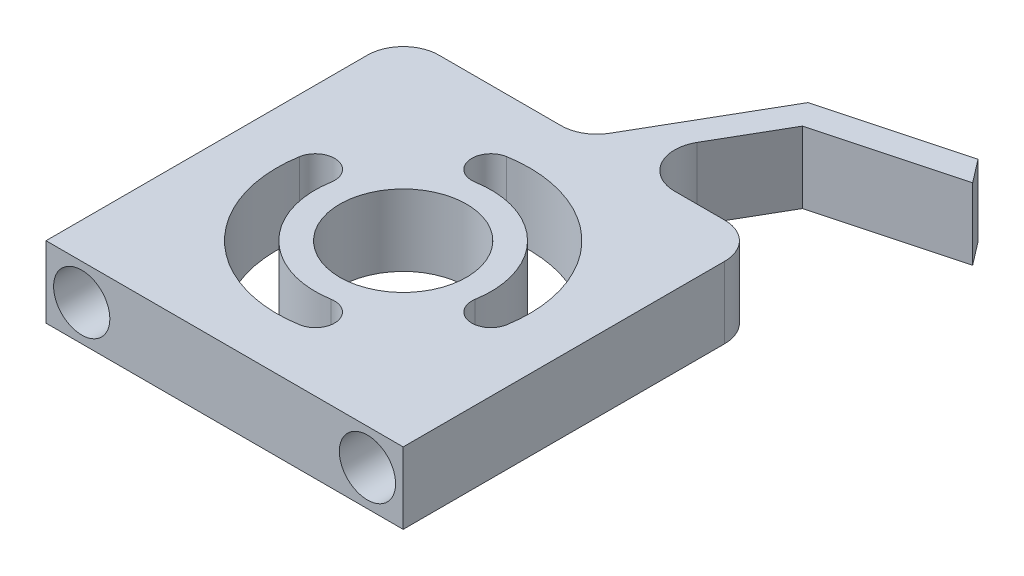
ISO-10303-21;
HEADER;
FILE_DESCRIPTION(('STEP AP214'),'2;1');
FILE_NAME('part.step','',(''),(''),'','','');
FILE_SCHEMA(('AUTOMOTIVE_DESIGN { 1 0 10303 214 1 1 1 1 }'));
ENDSEC;
DATA;
#1=APPLICATION_CONTEXT('core data for automotive mechanical design processes');
#2=APPLICATION_PROTOCOL_DEFINITION('international standard','automotive_design',2000,#1);
#3=PRODUCT_CONTEXT('',#1,'mechanical');
#4=PRODUCT('Part','Part','',(#3));
#5=PRODUCT_RELATED_PRODUCT_CATEGORY('part','',(#4));
#6=PRODUCT_DEFINITION_FORMATION('','',#4);
#7=PRODUCT_DEFINITION_CONTEXT('part definition',#1,'design');
#8=PRODUCT_DEFINITION('design','',#6,#7);
#9=PRODUCT_DEFINITION_SHAPE('','',#8);
#10=(LENGTH_UNIT() NAMED_UNIT(*) SI_UNIT(.MILLI.,.METRE.));
#11=(NAMED_UNIT(*) PLANE_ANGLE_UNIT() SI_UNIT($,.RADIAN.));
#12=(NAMED_UNIT(*) SI_UNIT($,.STERADIAN.) SOLID_ANGLE_UNIT());
#13=UNCERTAINTY_MEASURE_WITH_UNIT(LENGTH_MEASURE(1.E-05),#10,'distance_accuracy_value','');
#14=(GEOMETRIC_REPRESENTATION_CONTEXT(3) GLOBAL_UNCERTAINTY_ASSIGNED_CONTEXT((#13)) GLOBAL_UNIT_ASSIGNED_CONTEXT((#10,
#11,#12)) REPRESENTATION_CONTEXT('',''));
#15=CARTESIAN_POINT('',(0.,0.,0.));
#16=DIRECTION('',(0.,0.,1.));
#17=DIRECTION('',(1.,0.,0.));
#18=AXIS2_PLACEMENT_3D('',#15,#16,#17);
#19=CARTESIAN_POINT('',(-20.,8.,-20.));
#20=DIRECTION('',(0.,0.,1.));
#21=DIRECTION('',(1.,0.,0.));
#22=AXIS2_PLACEMENT_3D('',#19,#20,#21);
#23=PLANE('',#22);
#24=DIRECTION('',(-1.,0.,0.));
#25=VECTOR('',#24,1.);
#26=CARTESIAN_POINT('',(-20.,8.,-20.));
#27=LINE('',#26,#25);
#28=CARTESIAN_POINT('',(-2.30940107675851,8.,-20.));
#29=VERTEX_POINT('',#28);
#30=CARTESIAN_POINT('',(-16.,8.,-20.));
#31=VERTEX_POINT('',#30);
#32=EDGE_CURVE('E320',#29,#31,#27,.T.);
#33=ORIENTED_EDGE('',*,*,#32,.F.);
#34=DIRECTION('',(0.,1.,0.));
#35=VECTOR('',#34,1.);
#36=CARTESIAN_POINT('',(-2.30940107675851,8.,-20.));
#37=LINE('',#36,#35);
#38=CARTESIAN_POINT('',(-2.30940107675851,0.,-20.));
#39=VERTEX_POINT('',#38);
#40=EDGE_CURVE('E52',#29,#39,#37,.F.);
#41=ORIENTED_EDGE('',*,*,#40,.T.);
#42=DIRECTION('',(-1.,0.,0.));
#43=VECTOR('',#42,1.);
#44=CARTESIAN_POINT('',(-20.,0.,-20.));
#45=LINE('',#44,#43);
#46=CARTESIAN_POINT('',(-16.,0.,-20.));
#47=VERTEX_POINT('',#46);
#48=EDGE_CURVE('E332',#39,#47,#45,.T.);
#49=ORIENTED_EDGE('',*,*,#48,.T.);
#50=DIRECTION('',(0.,-1.,0.));
#51=VECTOR('',#50,1.);
#52=CARTESIAN_POINT('',(-16.,8.,-20.));
#53=LINE('',#52,#51);
#54=EDGE_CURVE('E344',#47,#31,#53,.F.);
#55=ORIENTED_EDGE('',*,*,#54,.T.);
#56=EDGE_LOOP('',(#33,#41,#49,#55));
#57=FACE_BOUND('',#56,.T.);
#58=ADVANCED_FACE('F37',(#57),#23,.F.);
#59=CARTESIAN_POINT('',(0.,8.,0.));
#60=DIRECTION('',(0.,-1.,0.));
#61=DIRECTION('',(0.,0.,-1.));
#62=AXIS2_PLACEMENT_3D('',#59,#60,#61);
#63=PLANE('',#62);
#64=CARTESIAN_POINT('',(-1.99999999999999,8.,-11.8321595661992));
#65=DIRECTION('',(0.,1.,0.));
#66=DIRECTION('',(0.,0.,-1.));
#67=AXIS2_PLACEMENT_3D('',#64,#65,#66);
#68=CIRCLE('',#67,2.15);
#69=CARTESIAN_POINT('',(-2.35833333333333,8.,-13.9520881551433));
#70=VERTEX_POINT('',#69);
#71=CARTESIAN_POINT('',(-1.64166666666666,8.,-9.7122309772552));
#72=VERTEX_POINT('',#71);
#73=EDGE_CURVE('E286',#70,#72,#68,.T.);
#74=ORIENTED_EDGE('',*,*,#73,.F.);
#75=CARTESIAN_POINT('',(0.,8.,0.));
#76=DIRECTION('',(0.,1.,0.));
#77=DIRECTION('',(0.,0.,-1.));
#78=AXIS2_PLACEMENT_3D('',#75,#76,#77);
#79=CIRCLE('',#78,14.15);
#80=CARTESIAN_POINT('',(13.9520881551433,8.,2.35833333333334));
#81=VERTEX_POINT('',#80);
#82=EDGE_CURVE('E294',#81,#70,#79,.T.);
#83=ORIENTED_EDGE('',*,*,#82,.F.);
#84=CARTESIAN_POINT('',(11.8321595661992,8.,2.00000000000001));
#85=DIRECTION('',(0.,1.,0.));
#86=DIRECTION('',(0.,0.,-1.));
#87=AXIS2_PLACEMENT_3D('',#84,#85,#86);
#88=CIRCLE('',#87,2.15);
#89=CARTESIAN_POINT('',(9.7122309772552,8.,1.64166666666668));
#90=VERTEX_POINT('',#89);
#91=EDGE_CURVE('E291',#90,#81,#88,.T.);
#92=ORIENTED_EDGE('',*,*,#91,.F.);
#93=CARTESIAN_POINT('',(0.,8.,0.));
#94=DIRECTION('',(0.,-1.,0.));
#95=DIRECTION('',(0.,0.,-1.));
#96=AXIS2_PLACEMENT_3D('',#93,#94,#95);
#97=CIRCLE('',#96,9.85);
#98=EDGE_CURVE('E288',#72,#90,#97,.T.);
#99=ORIENTED_EDGE('',*,*,#98,.F.);
#100=EDGE_LOOP('',(#74,#83,#92,#99));
#101=FACE_BOUND('',#100,.T.);
#102=DIRECTION('',(0.,0.,-1.));
#103=VECTOR('',#102,1.);
#104=CARTESIAN_POINT('',(20.,8.,20.));
#105=LINE('',#104,#103);
#106=CARTESIAN_POINT('',(20.,8.,20.));
#107=VERTEX_POINT('',#106);
#108=CARTESIAN_POINT('',(20.,8.,-16.));
#109=VERTEX_POINT('',#108);
#110=EDGE_CURVE('E317',#107,#109,#105,.T.);
#111=ORIENTED_EDGE('',*,*,#110,.T.);
#112=CARTESIAN_POINT('',(16.,8.,-16.));
#113=DIRECTION('',(0.,-1.,0.));
#114=DIRECTION('',(0.,0.,-1.));
#115=AXIS2_PLACEMENT_3D('',#112,#113,#114);
#116=CIRCLE('',#115,4.);
#117=CARTESIAN_POINT('',(16.,8.,-20.));
#118=VERTEX_POINT('',#117);
#119=EDGE_CURVE('E359',#109,#118,#116,.F.);
#120=ORIENTED_EDGE('',*,*,#119,.T.);
#121=CARTESIAN_POINT('',(10.3923048454132,8.,-20.));
#122=VERTEX_POINT('',#121);
#123=EDGE_CURVE('E322',#118,#122,#27,.T.);
#124=ORIENTED_EDGE('',*,*,#123,.T.);
#125=CARTESIAN_POINT('',(10.3923048454132,8.,-24.));
#126=DIRECTION('',(0.,-1.,0.));
#127=DIRECTION('',(0.,0.,-1.));
#128=AXIS2_PLACEMENT_3D('',#125,#126,#127);
#129=CIRCLE('',#128,4.);
#130=CARTESIAN_POINT('',(6.92820323027548,8.,-26.));
#131=VERTEX_POINT('',#130);
#132=EDGE_CURVE('E372',#122,#131,#129,.T.);
#133=ORIENTED_EDGE('',*,*,#132,.T.);
#134=DIRECTION('',(0.499999999999998,0.,-0.86602540378444));
#135=VECTOR('',#134,1.);
#136=CARTESIAN_POINT('',(11.2436985848823,8.,-33.4746572140065));
#137=LINE('',#136,#135);
#138=CARTESIAN_POINT('',(11.2436985848823,8.,-33.4746572140065));
#139=VERTEX_POINT('',#138);
#140=EDGE_CURVE('E221',#131,#139,#137,.T.);
#141=ORIENTED_EDGE('',*,*,#140,.T.);
#142=DIRECTION('',(0.965925826289068,0.,-0.258819045102521));
#143=VECTOR('',#142,1.);
#144=CARTESIAN_POINT('',(26.2727258472751,8.,-37.50167293199));
#145=LINE('',#144,#143);
#146=CARTESIAN_POINT('',(26.2727258472751,8.,-37.50167293199));
#147=VERTEX_POINT('',#146);
#148=EDGE_CURVE('E202',#139,#147,#145,.T.);
#149=ORIENTED_EDGE('',*,*,#148,.T.);
#150=DIRECTION('',(-0.608761429008722,0.,-0.793353340291234));
#151=VECTOR('',#150,1.);
#152=CARTESIAN_POINT('',(24.2959699794815,8.,-40.0778313348114));
#153=LINE('',#152,#151);
#154=CARTESIAN_POINT('',(24.2959699794815,8.,-40.0778313348114));
#155=VERTEX_POINT('',#154);
#156=EDGE_CURVE('E224',#147,#155,#153,.T.);
#157=ORIENTED_EDGE('',*,*,#156,.T.);
#158=DIRECTION('',(-0.965925826289068,0.,0.258819045102522));
#159=VECTOR('',#158,1.);
#160=CARTESIAN_POINT('',(9.26694271708858,8.,-36.0508156168279));
#161=LINE('',#160,#159);
#162=CARTESIAN_POINT('',(9.26694271708858,8.,-36.0508156168279));
#163=VERTEX_POINT('',#162);
#164=EDGE_CURVE('E227',#155,#163,#161,.T.);
#165=ORIENTED_EDGE('',*,*,#164,.T.);
#166=DIRECTION('',(-0.499999999999998,0.,0.86602540378444));
#167=VECTOR('',#166,1.);
#168=CARTESIAN_POINT('',(0.,8.,-20.));
#169=LINE('',#168,#167);
#170=CARTESIAN_POINT('',(1.15470053837925,8.,-22.));
#171=VERTEX_POINT('',#170);
#172=EDGE_CURVE('E196',#163,#171,#169,.T.);
#173=ORIENTED_EDGE('',*,*,#172,.T.);
#174=CARTESIAN_POINT('',(-2.30940107675851,8.,-24.));
#175=DIRECTION('',(0.,-1.,0.));
#176=DIRECTION('',(0.,0.,-1.));
#177=AXIS2_PLACEMENT_3D('',#174,#175,#176);
#178=CIRCLE('',#177,4.);
#179=EDGE_CURVE('E45',#171,#29,#178,.T.);
#180=ORIENTED_EDGE('',*,*,#179,.T.);
#181=ORIENTED_EDGE('',*,*,#32,.T.);
#182=CARTESIAN_POINT('',(-16.,8.,-16.));
#183=DIRECTION('',(0.,-1.,0.));
#184=DIRECTION('',(0.,0.,-1.));
#185=AXIS2_PLACEMENT_3D('',#182,#183,#184);
#186=CIRCLE('',#185,4.);
#187=CARTESIAN_POINT('',(-20.,8.,-16.));
#188=VERTEX_POINT('',#187);
#189=EDGE_CURVE('E357',#31,#188,#186,.F.);
#190=ORIENTED_EDGE('',*,*,#189,.T.);
#191=DIRECTION('',(0.,0.,1.));
#192=VECTOR('',#191,1.);
#193=CARTESIAN_POINT('',(-20.,8.,20.));
#194=LINE('',#193,#192);
#195=CARTESIAN_POINT('',(-20.,8.,20.));
#196=VERTEX_POINT('',#195);
#197=EDGE_CURVE('E325',#188,#196,#194,.T.);
#198=ORIENTED_EDGE('',*,*,#197,.T.);
#199=DIRECTION('',(1.,0.,0.));
#200=VECTOR('',#199,1.);
#201=CARTESIAN_POINT('',(-20.,8.,20.));
#202=LINE('',#201,#200);
#203=EDGE_CURVE('E327',#196,#107,#202,.T.);
#204=ORIENTED_EDGE('',*,*,#203,.T.);
#205=EDGE_LOOP('',(#111,#120,#124,#133,#141,#149,#157,#165,#173,#180,#181,#190,#198,#204));
#206=FACE_BOUND('',#205,.T.);
#207=CARTESIAN_POINT('',(-11.8321595661992,8.,-2.));
#208=DIRECTION('',(0.,1.,0.));
#209=DIRECTION('',(0.,0.,-1.));
#210=AXIS2_PLACEMENT_3D('',#207,#208,#209);
#211=CIRCLE('',#210,2.15);
#212=CARTESIAN_POINT('',(-9.7122309772552,8.,-1.64166666666667));
#213=VERTEX_POINT('',#212);
#214=CARTESIAN_POINT('',(-13.9520881551433,8.,-2.35833333333334));
#215=VERTEX_POINT('',#214);
#216=EDGE_CURVE('E255',#213,#215,#211,.T.);
#217=ORIENTED_EDGE('',*,*,#216,.F.);
#218=CARTESIAN_POINT('',(0.,8.,0.));
#219=DIRECTION('',(0.,-1.,0.));
#220=DIRECTION('',(0.,0.,1.));
#221=AXIS2_PLACEMENT_3D('',#218,#219,#220);
#222=CIRCLE('',#221,9.85);
#223=CARTESIAN_POINT('',(1.64166666666666,8.,9.7122309772552));
#224=VERTEX_POINT('',#223);
#225=EDGE_CURVE('E263',#224,#213,#222,.T.);
#226=ORIENTED_EDGE('',*,*,#225,.F.);
#227=CARTESIAN_POINT('',(1.99999999999999,8.,11.8321595661992));
#228=DIRECTION('',(0.,1.,0.));
#229=DIRECTION('',(0.,0.,-1.));
#230=AXIS2_PLACEMENT_3D('',#227,#228,#229);
#231=CIRCLE('',#230,2.15);
#232=CARTESIAN_POINT('',(2.35833333333333,8.,13.9520881551433));
#233=VERTEX_POINT('',#232);
#234=EDGE_CURVE('E260',#233,#224,#231,.T.);
#235=ORIENTED_EDGE('',*,*,#234,.F.);
#236=CARTESIAN_POINT('',(0.,8.,0.));
#237=DIRECTION('',(0.,1.,0.));
#238=DIRECTION('',(0.,0.,1.));
#239=AXIS2_PLACEMENT_3D('',#236,#237,#238);
#240=CIRCLE('',#239,14.15);
#241=EDGE_CURVE('E257',#215,#233,#240,.T.);
#242=ORIENTED_EDGE('',*,*,#241,.F.);
#243=EDGE_LOOP('',(#217,#226,#235,#242));
#244=FACE_BOUND('',#243,.T.);
#245=CARTESIAN_POINT('',(0.,8.,0.));
#246=DIRECTION('',(0.,1.,0.));
#247=DIRECTION('',(0.,0.,1.));
#248=AXIS2_PLACEMENT_3D('',#245,#246,#247);
#249=CIRCLE('',#248,7.1);
#250=CARTESIAN_POINT('',(0.,8.,7.1));
#251=VERTEX_POINT('',#250);
#252=EDGE_CURVE('E249',#251,#251,#249,.T.);
#253=ORIENTED_EDGE('',*,*,#252,.F.);
#254=EDGE_LOOP('',(#253));
#255=FACE_BOUND('',#254,.T.);
#256=ADVANCED_FACE('F382',(#101,#206,#244,#255),#63,.F.);
#257=CARTESIAN_POINT('',(0.,0.,0.));
#258=DIRECTION('',(0.,-1.,0.));
#259=DIRECTION('',(0.,0.,-1.));
#260=AXIS2_PLACEMENT_3D('',#257,#258,#259);
#261=PLANE('',#260);
#262=CARTESIAN_POINT('',(0.,0.,0.));
#263=DIRECTION('',(0.,-1.,0.));
#264=DIRECTION('',(0.,0.,1.));
#265=AXIS2_PLACEMENT_3D('',#262,#263,#264);
#266=CIRCLE('',#265,9.85);
#267=CARTESIAN_POINT('',(1.64166666666666,0.,9.7122309772552));
#268=VERTEX_POINT('',#267);
#269=CARTESIAN_POINT('',(-9.7122309772552,0.,-1.64166666666667));
#270=VERTEX_POINT('',#269);
#271=EDGE_CURVE('E258',#268,#270,#266,.T.);
#272=ORIENTED_EDGE('',*,*,#271,.T.);
#273=CARTESIAN_POINT('',(-11.8321595661992,0.,-2.));
#274=DIRECTION('',(0.,1.,0.));
#275=DIRECTION('',(0.,0.,-1.));
#276=AXIS2_PLACEMENT_3D('',#273,#274,#275);
#277=CIRCLE('',#276,2.15);
#278=CARTESIAN_POINT('',(-13.9520881551433,0.,-2.35833333333334));
#279=VERTEX_POINT('',#278);
#280=EDGE_CURVE('E252',#270,#279,#277,.T.);
#281=ORIENTED_EDGE('',*,*,#280,.T.);
#282=CARTESIAN_POINT('',(0.,0.,0.));
#283=DIRECTION('',(0.,1.,0.));
#284=DIRECTION('',(0.,0.,1.));
#285=AXIS2_PLACEMENT_3D('',#282,#283,#284);
#286=CIRCLE('',#285,14.15);
#287=CARTESIAN_POINT('',(2.35833333333333,0.,13.9520881551433));
#288=VERTEX_POINT('',#287);
#289=EDGE_CURVE('E268',#279,#288,#286,.T.);
#290=ORIENTED_EDGE('',*,*,#289,.T.);
#291=CARTESIAN_POINT('',(1.99999999999999,0.,11.8321595661992));
#292=DIRECTION('',(0.,1.,0.));
#293=DIRECTION('',(0.,0.,-1.));
#294=AXIS2_PLACEMENT_3D('',#291,#292,#293);
#295=CIRCLE('',#294,2.15);
#296=EDGE_CURVE('E271',#288,#268,#295,.T.);
#297=ORIENTED_EDGE('',*,*,#296,.T.);
#298=EDGE_LOOP('',(#272,#281,#290,#297));
#299=FACE_BOUND('',#298,.T.);
#300=CARTESIAN_POINT('',(0.,0.,0.));
#301=DIRECTION('',(0.,1.,0.));
#302=DIRECTION('',(0.,0.,-1.));
#303=AXIS2_PLACEMENT_3D('',#300,#301,#302);
#304=CIRCLE('',#303,14.15);
#305=CARTESIAN_POINT('',(13.9520881551433,0.,2.35833333333334));
#306=VERTEX_POINT('',#305);
#307=CARTESIAN_POINT('',(-2.35833333333333,0.,-13.9520881551433));
#308=VERTEX_POINT('',#307);
#309=EDGE_CURVE('E289',#306,#308,#304,.T.);
#310=ORIENTED_EDGE('',*,*,#309,.T.);
#311=CARTESIAN_POINT('',(-1.99999999999999,0.,-11.8321595661992));
#312=DIRECTION('',(0.,1.,0.));
#313=DIRECTION('',(0.,0.,-1.));
#314=AXIS2_PLACEMENT_3D('',#311,#312,#313);
#315=CIRCLE('',#314,2.15);
#316=CARTESIAN_POINT('',(-1.64166666666666,0.,-9.7122309772552));
#317=VERTEX_POINT('',#316);
#318=EDGE_CURVE('E285',#308,#317,#315,.T.);
#319=ORIENTED_EDGE('',*,*,#318,.T.);
#320=CARTESIAN_POINT('',(0.,0.,0.));
#321=DIRECTION('',(0.,-1.,0.));
#322=DIRECTION('',(0.,0.,-1.));
#323=AXIS2_PLACEMENT_3D('',#320,#321,#322);
#324=CIRCLE('',#323,9.85);
#325=CARTESIAN_POINT('',(9.7122309772552,0.,1.64166666666668));
#326=VERTEX_POINT('',#325);
#327=EDGE_CURVE('E299',#317,#326,#324,.T.);
#328=ORIENTED_EDGE('',*,*,#327,.T.);
#329=CARTESIAN_POINT('',(11.8321595661992,0.,2.00000000000001));
#330=DIRECTION('',(0.,1.,0.));
#331=DIRECTION('',(0.,0.,-1.));
#332=AXIS2_PLACEMENT_3D('',#329,#330,#331);
#333=CIRCLE('',#332,2.15);
#334=EDGE_CURVE('E302',#326,#306,#333,.T.);
#335=ORIENTED_EDGE('',*,*,#334,.T.);
#336=EDGE_LOOP('',(#310,#319,#328,#335));
#337=FACE_BOUND('',#336,.T.);
#338=CARTESIAN_POINT('',(16.,0.,-20.));
#339=VERTEX_POINT('',#338);
#340=CARTESIAN_POINT('',(10.3923048454132,0.,-20.));
#341=VERTEX_POINT('',#340);
#342=EDGE_CURVE('E333',#339,#341,#45,.T.);
#343=ORIENTED_EDGE('',*,*,#342,.F.);
#344=CARTESIAN_POINT('',(16.,0.,-16.));
#345=DIRECTION('',(0.,-1.,0.));
#346=DIRECTION('',(0.,0.,-1.));
#347=AXIS2_PLACEMENT_3D('',#344,#345,#346);
#348=CIRCLE('',#347,4.);
#349=CARTESIAN_POINT('',(20.,0.,-16.));
#350=VERTEX_POINT('',#349);
#351=EDGE_CURVE('E353',#339,#350,#348,.T.);
#352=ORIENTED_EDGE('',*,*,#351,.T.);
#353=DIRECTION('',(0.,0.,-1.));
#354=VECTOR('',#353,1.);
#355=CARTESIAN_POINT('',(20.,0.,20.));
#356=LINE('',#355,#354);
#357=CARTESIAN_POINT('',(20.,0.,20.));
#358=VERTEX_POINT('',#357);
#359=EDGE_CURVE('E316',#358,#350,#356,.T.);
#360=ORIENTED_EDGE('',*,*,#359,.F.);
#361=DIRECTION('',(1.,0.,0.));
#362=VECTOR('',#361,1.);
#363=CARTESIAN_POINT('',(-20.,0.,20.));
#364=LINE('',#363,#362);
#365=CARTESIAN_POINT('',(-20.,0.,20.));
#366=VERTEX_POINT('',#365);
#367=EDGE_CURVE('E321',#366,#358,#364,.T.);
#368=ORIENTED_EDGE('',*,*,#367,.F.);
#369=DIRECTION('',(0.,0.,1.));
#370=VECTOR('',#369,1.);
#371=CARTESIAN_POINT('',(-20.,0.,20.));
#372=LINE('',#371,#370);
#373=CARTESIAN_POINT('',(-20.,0.,-16.));
#374=VERTEX_POINT('',#373);
#375=EDGE_CURVE('E336',#374,#366,#372,.T.);
#376=ORIENTED_EDGE('',*,*,#375,.F.);
#377=CARTESIAN_POINT('',(-16.,0.,-16.));
#378=DIRECTION('',(0.,-1.,0.));
#379=DIRECTION('',(0.,0.,-1.));
#380=AXIS2_PLACEMENT_3D('',#377,#378,#379);
#381=CIRCLE('',#380,4.);
#382=EDGE_CURVE('E350',#374,#47,#381,.T.);
#383=ORIENTED_EDGE('',*,*,#382,.T.);
#384=ORIENTED_EDGE('',*,*,#48,.F.);
#385=CARTESIAN_POINT('',(-2.30940107675851,0.,-24.));
#386=DIRECTION('',(0.,-1.,0.));
#387=DIRECTION('',(0.,0.,-1.));
#388=AXIS2_PLACEMENT_3D('',#385,#386,#387);
#389=CIRCLE('',#388,4.);
#390=CARTESIAN_POINT('',(1.15470053837925,0.,-22.));
#391=VERTEX_POINT('',#390);
#392=EDGE_CURVE('E11',#39,#391,#389,.F.);
#393=ORIENTED_EDGE('',*,*,#392,.T.);
#394=DIRECTION('',(-0.499999999999998,0.,0.86602540378444));
#395=VECTOR('',#394,1.);
#396=CARTESIAN_POINT('',(0.,0.,-20.));
#397=LINE('',#396,#395);
#398=CARTESIAN_POINT('',(9.26694271708858,0.,-36.0508156168279));
#399=VERTEX_POINT('',#398);
#400=EDGE_CURVE('E204',#399,#391,#397,.T.);
#401=ORIENTED_EDGE('',*,*,#400,.F.);
#402=DIRECTION('',(-0.965925826289068,0.,0.258819045102522));
#403=VECTOR('',#402,1.);
#404=CARTESIAN_POINT('',(9.26694271708858,0.,-36.0508156168279));
#405=LINE('',#404,#403);
#406=CARTESIAN_POINT('',(24.2959699794815,0.,-40.0778313348114));
#407=VERTEX_POINT('',#406);
#408=EDGE_CURVE('E214',#407,#399,#405,.T.);
#409=ORIENTED_EDGE('',*,*,#408,.F.);
#410=DIRECTION('',(-0.608761429008722,0.,-0.793353340291234));
#411=VECTOR('',#410,1.);
#412=CARTESIAN_POINT('',(24.2959699794815,0.,-40.0778313348114));
#413=LINE('',#412,#411);
#414=CARTESIAN_POINT('',(26.2727258472751,0.,-37.50167293199));
#415=VERTEX_POINT('',#414);
#416=EDGE_CURVE('E212',#415,#407,#413,.T.);
#417=ORIENTED_EDGE('',*,*,#416,.F.);
#418=DIRECTION('',(0.965925826289068,0.,-0.258819045102521));
#419=VECTOR('',#418,1.);
#420=CARTESIAN_POINT('',(26.2727258472751,0.,-37.50167293199));
#421=LINE('',#420,#419);
#422=CARTESIAN_POINT('',(11.2436985848823,0.,-33.4746572140065));
#423=VERTEX_POINT('',#422);
#424=EDGE_CURVE('E195',#423,#415,#421,.T.);
#425=ORIENTED_EDGE('',*,*,#424,.F.);
#426=DIRECTION('',(0.499999999999998,0.,-0.86602540378444));
#427=VECTOR('',#426,1.);
#428=CARTESIAN_POINT('',(11.2436985848823,0.,-33.4746572140065));
#429=LINE('',#428,#427);
#430=CARTESIAN_POINT('',(6.92820323027548,0.,-26.));
#431=VERTEX_POINT('',#430);
#432=EDGE_CURVE('E184',#431,#423,#429,.T.);
#433=ORIENTED_EDGE('',*,*,#432,.F.);
#434=CARTESIAN_POINT('',(10.3923048454132,0.,-24.));
#435=DIRECTION('',(0.,-1.,0.));
#436=DIRECTION('',(0.,0.,-1.));
#437=AXIS2_PLACEMENT_3D('',#434,#435,#436);
#438=CIRCLE('',#437,4.);
#439=EDGE_CURVE('E374',#431,#341,#438,.F.);
#440=ORIENTED_EDGE('',*,*,#439,.T.);
#441=EDGE_LOOP('',(#343,#352,#360,#368,#376,#383,#384,#393,#401,#409,#417,#425,#433,#440));
#442=FACE_BOUND('',#441,.T.);
#443=CARTESIAN_POINT('',(0.,0.,0.));
#444=DIRECTION('',(0.,1.,0.));
#445=DIRECTION('',(0.,0.,1.));
#446=AXIS2_PLACEMENT_3D('',#443,#444,#445);
#447=CIRCLE('',#446,7.1);
#448=CARTESIAN_POINT('',(0.,0.,7.1));
#449=VERTEX_POINT('',#448);
#450=EDGE_CURVE('E240',#449,#449,#447,.T.);
#451=ORIENTED_EDGE('',*,*,#450,.T.);
#452=EDGE_LOOP('',(#451));
#453=FACE_BOUND('',#452,.T.);
#454=ADVANCED_FACE('F208',(#299,#337,#442,#453),#261,.T.);
#455=CARTESIAN_POINT('',(20.,8.,20.));
#456=DIRECTION('',(-1.,0.,0.));
#457=DIRECTION('',(0.,0.,1.));
#458=AXIS2_PLACEMENT_3D('',#455,#456,#457);
#459=PLANE('',#458);
#460=ORIENTED_EDGE('',*,*,#359,.T.);
#461=DIRECTION('',(0.,-1.,0.));
#462=VECTOR('',#461,1.);
#463=CARTESIAN_POINT('',(20.,8.,-16.));
#464=LINE('',#463,#462);
#465=EDGE_CURVE('E355',#350,#109,#464,.F.);
#466=ORIENTED_EDGE('',*,*,#465,.T.);
#467=ORIENTED_EDGE('',*,*,#110,.F.);
#468=DIRECTION('',(0.,-1.,0.));
#469=VECTOR('',#468,1.);
#470=CARTESIAN_POINT('',(20.,8.,20.));
#471=LINE('',#470,#469);
#472=EDGE_CURVE('E329',#107,#358,#471,.T.);
#473=ORIENTED_EDGE('',*,*,#472,.T.);
#474=EDGE_LOOP('',(#460,#466,#467,#473));
#475=FACE_BOUND('',#474,.T.);
#476=ADVANCED_FACE('F391',(#475),#459,.F.);
#477=ORIENTED_EDGE('',*,*,#342,.T.);
#478=DIRECTION('',(0.,1.,0.));
#479=VECTOR('',#478,1.);
#480=CARTESIAN_POINT('',(10.3923048454132,8.,-20.));
#481=LINE('',#480,#479);
#482=EDGE_CURVE('E364',#341,#122,#481,.T.);
#483=ORIENTED_EDGE('',*,*,#482,.T.);
#484=ORIENTED_EDGE('',*,*,#123,.F.);
#485=DIRECTION('',(0.,-1.,0.));
#486=VECTOR('',#485,1.);
#487=CARTESIAN_POINT('',(16.,8.,-20.));
#488=LINE('',#487,#486);
#489=EDGE_CURVE('E347',#118,#339,#488,.T.);
#490=ORIENTED_EDGE('',*,*,#489,.T.);
#491=EDGE_LOOP('',(#477,#483,#484,#490));
#492=FACE_BOUND('',#491,.T.);
#493=ADVANCED_FACE('F378',(#492),#23,.F.);
#494=CARTESIAN_POINT('',(-20.,8.,20.));
#495=DIRECTION('',(1.,0.,0.));
#496=DIRECTION('',(0.,0.,-1.));
#497=AXIS2_PLACEMENT_3D('',#494,#495,#496);
#498=PLANE('',#497);
#499=ORIENTED_EDGE('',*,*,#197,.F.);
#500=DIRECTION('',(0.,-1.,0.));
#501=VECTOR('',#500,1.);
#502=CARTESIAN_POINT('',(-20.,8.,-16.));
#503=LINE('',#502,#501);
#504=EDGE_CURVE('E361',#188,#374,#503,.T.);
#505=ORIENTED_EDGE('',*,*,#504,.T.);
#506=ORIENTED_EDGE('',*,*,#375,.T.);
#507=DIRECTION('',(0.,-1.,0.));
#508=VECTOR('',#507,1.);
#509=CARTESIAN_POINT('',(-20.,8.,20.));
#510=LINE('',#509,#508);
#511=EDGE_CURVE('E341',#196,#366,#510,.T.);
#512=ORIENTED_EDGE('',*,*,#511,.F.);
#513=EDGE_LOOP('',(#499,#505,#506,#512));
#514=FACE_BOUND('',#513,.T.);
#515=ADVANCED_FACE('F402',(#514),#498,.F.);
#516=CARTESIAN_POINT('',(-20.,8.,20.));
#517=DIRECTION('',(0.,0.,-1.));
#518=DIRECTION('',(-1.,0.,0.));
#519=AXIS2_PLACEMENT_3D('',#516,#517,#518);
#520=PLANE('',#519);
#521=CARTESIAN_POINT('',(-16.,4.,20.));
#522=DIRECTION('',(0.,0.,1.));
#523=DIRECTION('',(1.,0.,0.));
#524=AXIS2_PLACEMENT_3D('',#521,#522,#523);
#525=CIRCLE('',#524,3.15);
#526=CARTESIAN_POINT('',(-12.85,4.,20.));
#527=VERTEX_POINT('',#526);
#528=EDGE_CURVE('E241',#527,#527,#525,.T.);
#529=ORIENTED_EDGE('',*,*,#528,.F.);
#530=EDGE_LOOP('',(#529));
#531=FACE_BOUND('',#530,.T.);
#532=CARTESIAN_POINT('',(16.,4.,20.));
#533=DIRECTION('',(0.,0.,1.));
#534=DIRECTION('',(1.,0.,0.));
#535=AXIS2_PLACEMENT_3D('',#532,#533,#534);
#536=CIRCLE('',#535,3.15);
#537=CARTESIAN_POINT('',(19.15,4.,20.));
#538=VERTEX_POINT('',#537);
#539=EDGE_CURVE('E233',#538,#538,#536,.T.);
#540=ORIENTED_EDGE('',*,*,#539,.F.);
#541=EDGE_LOOP('',(#540));
#542=FACE_BOUND('',#541,.T.);
#543=ORIENTED_EDGE('',*,*,#367,.T.);
#544=ORIENTED_EDGE('',*,*,#472,.F.);
#545=ORIENTED_EDGE('',*,*,#203,.F.);
#546=ORIENTED_EDGE('',*,*,#511,.T.);
#547=EDGE_LOOP('',(#543,#544,#545,#546));
#548=FACE_BOUND('',#547,.T.);
#549=ADVANCED_FACE('F396',(#531,#542,#548),#520,.F.);
#550=CARTESIAN_POINT('',(-1.99999999999999,8.,-11.8321595661992));
#551=DIRECTION('',(0.,-1.,0.));
#552=DIRECTION('',(0.,0.,-1.));
#553=AXIS2_PLACEMENT_3D('',#550,#551,#552);
#554=CYLINDRICAL_SURFACE('',#553,2.15);
#555=ORIENTED_EDGE('',*,*,#318,.F.);
#556=DIRECTION('',(0.,-1.,0.));
#557=VECTOR('',#556,1.);
#558=CARTESIAN_POINT('',(-2.35833333333333,8.,-13.9520881551433));
#559=LINE('',#558,#557);
#560=EDGE_CURVE('E296',#70,#308,#559,.T.);
#561=ORIENTED_EDGE('',*,*,#560,.F.);
#562=ORIENTED_EDGE('',*,*,#73,.T.);
#563=DIRECTION('',(0.,-1.,0.));
#564=VECTOR('',#563,1.);
#565=CARTESIAN_POINT('',(-1.64166666666666,8.,-9.7122309772552));
#566=LINE('',#565,#564);
#567=EDGE_CURVE('E313',#72,#317,#566,.T.);
#568=ORIENTED_EDGE('',*,*,#567,.T.);
#569=EDGE_LOOP('',(#555,#561,#562,#568));
#570=FACE_BOUND('',#569,.T.);
#571=ADVANCED_FACE('F507',(#570),#554,.F.);
#572=CARTESIAN_POINT('',(0.,8.,0.));
#573=DIRECTION('',(0.,-1.,0.));
#574=DIRECTION('',(0.,0.,-1.));
#575=AXIS2_PLACEMENT_3D('',#572,#573,#574);
#576=CYLINDRICAL_SURFACE('',#575,9.85);
#577=ORIENTED_EDGE('',*,*,#327,.F.);
#578=ORIENTED_EDGE('',*,*,#567,.F.);
#579=ORIENTED_EDGE('',*,*,#98,.T.);
#580=DIRECTION('',(0.,-1.,0.));
#581=VECTOR('',#580,1.);
#582=CARTESIAN_POINT('',(9.7122309772552,8.,1.64166666666668));
#583=LINE('',#582,#581);
#584=EDGE_CURVE('E311',#90,#326,#583,.T.);
#585=ORIENTED_EDGE('',*,*,#584,.T.);
#586=EDGE_LOOP('',(#577,#578,#579,#585));
#587=FACE_BOUND('',#586,.T.);
#588=ADVANCED_FACE('F503',(#587),#576,.T.);
#589=CARTESIAN_POINT('',(11.8321595661992,8.,2.00000000000001));
#590=DIRECTION('',(0.,-1.,0.));
#591=DIRECTION('',(0.,0.,-1.));
#592=AXIS2_PLACEMENT_3D('',#589,#590,#591);
#593=CYLINDRICAL_SURFACE('',#592,2.15);
#594=ORIENTED_EDGE('',*,*,#334,.F.);
#595=ORIENTED_EDGE('',*,*,#584,.F.);
#596=ORIENTED_EDGE('',*,*,#91,.T.);
#597=DIRECTION('',(0.,-1.,0.));
#598=VECTOR('',#597,1.);
#599=CARTESIAN_POINT('',(13.9520881551433,8.,2.35833333333334));
#600=LINE('',#599,#598);
#601=EDGE_CURVE('E309',#81,#306,#600,.T.);
#602=ORIENTED_EDGE('',*,*,#601,.T.);
#603=EDGE_LOOP('',(#594,#595,#596,#602));
#604=FACE_BOUND('',#603,.T.);
#605=ADVANCED_FACE('F499',(#604),#593,.F.);
#606=CARTESIAN_POINT('',(0.,8.,0.));
#607=DIRECTION('',(0.,-1.,0.));
#608=DIRECTION('',(0.,0.,-1.));
#609=AXIS2_PLACEMENT_3D('',#606,#607,#608);
#610=CYLINDRICAL_SURFACE('',#609,14.15);
#611=ORIENTED_EDGE('',*,*,#309,.F.);
#612=ORIENTED_EDGE('',*,*,#601,.F.);
#613=ORIENTED_EDGE('',*,*,#82,.T.);
#614=ORIENTED_EDGE('',*,*,#560,.T.);
#615=EDGE_LOOP('',(#611,#612,#613,#614));
#616=FACE_BOUND('',#615,.T.);
#617=ADVANCED_FACE('F495',(#616),#610,.F.);
#618=CARTESIAN_POINT('',(-11.8321595661992,8.,-2.));
#619=DIRECTION('',(0.,-1.,0.));
#620=DIRECTION('',(0.,0.,-1.));
#621=AXIS2_PLACEMENT_3D('',#618,#619,#620);
#622=CYLINDRICAL_SURFACE('',#621,2.15);
#623=ORIENTED_EDGE('',*,*,#280,.F.);
#624=DIRECTION('',(0.,-1.,0.));
#625=VECTOR('',#624,1.);
#626=CARTESIAN_POINT('',(-9.7122309772552,8.,-1.64166666666667));
#627=LINE('',#626,#625);
#628=EDGE_CURVE('E265',#213,#270,#627,.T.);
#629=ORIENTED_EDGE('',*,*,#628,.F.);
#630=ORIENTED_EDGE('',*,*,#216,.T.);
#631=DIRECTION('',(0.,-1.,0.));
#632=VECTOR('',#631,1.);
#633=CARTESIAN_POINT('',(-13.9520881551433,8.,-2.35833333333334));
#634=LINE('',#633,#632);
#635=EDGE_CURVE('E282',#215,#279,#634,.T.);
#636=ORIENTED_EDGE('',*,*,#635,.T.);
#637=EDGE_LOOP('',(#623,#629,#630,#636));
#638=FACE_BOUND('',#637,.T.);
#639=ADVANCED_FACE('F491',(#638),#622,.F.);
#640=CARTESIAN_POINT('',(0.,8.,0.));
#641=DIRECTION('',(0.,-1.,0.));
#642=DIRECTION('',(0.,0.,-1.));
#643=AXIS2_PLACEMENT_3D('',#640,#641,#642);
#644=CYLINDRICAL_SURFACE('',#643,14.15);
#645=ORIENTED_EDGE('',*,*,#289,.F.);
#646=ORIENTED_EDGE('',*,*,#635,.F.);
#647=ORIENTED_EDGE('',*,*,#241,.T.);
#648=DIRECTION('',(0.,-1.,0.));
#649=VECTOR('',#648,1.);
#650=CARTESIAN_POINT('',(2.35833333333333,8.,13.9520881551433));
#651=LINE('',#650,#649);
#652=EDGE_CURVE('E280',#233,#288,#651,.T.);
#653=ORIENTED_EDGE('',*,*,#652,.T.);
#654=EDGE_LOOP('',(#645,#646,#647,#653));
#655=FACE_BOUND('',#654,.T.);
#656=ADVANCED_FACE('F487',(#655),#644,.F.);
#657=CARTESIAN_POINT('',(1.99999999999999,8.,11.8321595661992));
#658=DIRECTION('',(0.,-1.,0.));
#659=DIRECTION('',(0.,0.,-1.));
#660=AXIS2_PLACEMENT_3D('',#657,#658,#659);
#661=CYLINDRICAL_SURFACE('',#660,2.15);
#662=ORIENTED_EDGE('',*,*,#296,.F.);
#663=ORIENTED_EDGE('',*,*,#652,.F.);
#664=ORIENTED_EDGE('',*,*,#234,.T.);
#665=DIRECTION('',(0.,-1.,0.));
#666=VECTOR('',#665,1.);
#667=CARTESIAN_POINT('',(1.64166666666666,8.,9.7122309772552));
#668=LINE('',#667,#666);
#669=EDGE_CURVE('E278',#224,#268,#668,.T.);
#670=ORIENTED_EDGE('',*,*,#669,.T.);
#671=EDGE_LOOP('',(#662,#663,#664,#670));
#672=FACE_BOUND('',#671,.T.);
#673=ADVANCED_FACE('F483',(#672),#661,.F.);
#674=CARTESIAN_POINT('',(0.,8.,0.));
#675=DIRECTION('',(0.,-1.,0.));
#676=DIRECTION('',(0.,0.,-1.));
#677=AXIS2_PLACEMENT_3D('',#674,#675,#676);
#678=CYLINDRICAL_SURFACE('',#677,9.85);
#679=ORIENTED_EDGE('',*,*,#271,.F.);
#680=ORIENTED_EDGE('',*,*,#669,.F.);
#681=ORIENTED_EDGE('',*,*,#225,.T.);
#682=ORIENTED_EDGE('',*,*,#628,.T.);
#683=EDGE_LOOP('',(#679,#680,#681,#682));
#684=FACE_BOUND('',#683,.T.);
#685=ADVANCED_FACE('F479',(#684),#678,.T.);
#686=CARTESIAN_POINT('',(0.,8.,0.));
#687=DIRECTION('',(0.,-1.,0.));
#688=DIRECTION('',(0.,0.,-1.));
#689=AXIS2_PLACEMENT_3D('',#686,#687,#688);
#690=CYLINDRICAL_SURFACE('',#689,7.1);
#691=ORIENTED_EDGE('',*,*,#252,.T.);
#692=EDGE_LOOP('',(#691));
#693=FACE_BOUND('',#692,.T.);
#694=ORIENTED_EDGE('',*,*,#450,.F.);
#695=EDGE_LOOP('',(#694));
#696=FACE_BOUND('',#695,.T.);
#697=ADVANCED_FACE('F450',(#693,#696),#690,.F.);
#698=CARTESIAN_POINT('',(16.,8.,-16.));
#699=DIRECTION('',(0.,-1.,0.));
#700=DIRECTION('',(0.,0.,-1.));
#701=AXIS2_PLACEMENT_3D('',#698,#699,#700);
#702=CYLINDRICAL_SURFACE('',#701,4.);
#703=ORIENTED_EDGE('',*,*,#119,.F.);
#704=ORIENTED_EDGE('',*,*,#465,.F.);
#705=ORIENTED_EDGE('',*,*,#351,.F.);
#706=ORIENTED_EDGE('',*,*,#489,.F.);
#707=EDGE_LOOP('',(#703,#704,#705,#706));
#708=FACE_BOUND('',#707,.T.);
#709=ADVANCED_FACE('F386',(#708),#702,.T.);
#710=CARTESIAN_POINT('',(-16.,8.,-16.));
#711=DIRECTION('',(0.,-1.,0.));
#712=DIRECTION('',(0.,0.,-1.));
#713=AXIS2_PLACEMENT_3D('',#710,#711,#712);
#714=CYLINDRICAL_SURFACE('',#713,4.);
#715=ORIENTED_EDGE('',*,*,#189,.F.);
#716=ORIENTED_EDGE('',*,*,#54,.F.);
#717=ORIENTED_EDGE('',*,*,#382,.F.);
#718=ORIENTED_EDGE('',*,*,#504,.F.);
#719=EDGE_LOOP('',(#715,#716,#717,#718));
#720=FACE_BOUND('',#719,.T.);
#721=ADVANCED_FACE('F406',(#720),#714,.T.);
#722=CARTESIAN_POINT('',(16.,4.,15.3));
#723=DIRECTION('',(0.,0.,1.));
#724=DIRECTION('',(1.,0.,0.));
#725=AXIS2_PLACEMENT_3D('',#722,#723,#724);
#726=CYLINDRICAL_SURFACE('',#725,3.15);
#727=CARTESIAN_POINT('',(16.,4.,15.3));
#728=DIRECTION('',(0.,0.,1.));
#729=DIRECTION('',(1.,0.,0.));
#730=AXIS2_PLACEMENT_3D('',#727,#728,#729);
#731=CIRCLE('',#730,3.15);
#732=CARTESIAN_POINT('',(19.15,4.,15.3));
#733=VERTEX_POINT('',#732);
#734=EDGE_CURVE('E244',#733,#733,#731,.T.);
#735=ORIENTED_EDGE('',*,*,#734,.F.);
#736=EDGE_LOOP('',(#735));
#737=FACE_BOUND('',#736,.T.);
#738=ORIENTED_EDGE('',*,*,#539,.T.);
#739=EDGE_LOOP('',(#738));
#740=FACE_BOUND('',#739,.T.);
#741=ADVANCED_FACE('F452',(#737,#740),#726,.F.);
#742=CARTESIAN_POINT('',(16.,4.,15.3));
#743=DIRECTION('',(0.,0.,1.));
#744=DIRECTION('',(1.,0.,0.));
#745=AXIS2_PLACEMENT_3D('',#742,#743,#744);
#746=PLANE('',#745);
#747=ORIENTED_EDGE('',*,*,#734,.T.);
#748=EDGE_LOOP('',(#747));
#749=FACE_BOUND('',#748,.T.);
#750=ADVANCED_FACE('F469',(#749),#746,.T.);
#751=CARTESIAN_POINT('',(-16.,4.,15.3));
#752=DIRECTION('',(0.,0.,1.));
#753=DIRECTION('',(1.,0.,0.));
#754=AXIS2_PLACEMENT_3D('',#751,#752,#753);
#755=CYLINDRICAL_SURFACE('',#754,3.15);
#756=CARTESIAN_POINT('',(-16.,4.,15.3));
#757=DIRECTION('',(0.,0.,1.));
#758=DIRECTION('',(1.,0.,0.));
#759=AXIS2_PLACEMENT_3D('',#756,#757,#758);
#760=CIRCLE('',#759,3.15);
#761=CARTESIAN_POINT('',(-12.85,4.,15.3));
#762=VERTEX_POINT('',#761);
#763=EDGE_CURVE('E237',#762,#762,#760,.T.);
#764=ORIENTED_EDGE('',*,*,#763,.F.);
#765=EDGE_LOOP('',(#764));
#766=FACE_BOUND('',#765,.T.);
#767=ORIENTED_EDGE('',*,*,#528,.T.);
#768=EDGE_LOOP('',(#767));
#769=FACE_BOUND('',#768,.T.);
#770=ADVANCED_FACE('F465',(#766,#769),#755,.F.);
#771=CARTESIAN_POINT('',(-16.,4.,15.3));
#772=DIRECTION('',(0.,0.,1.));
#773=DIRECTION('',(1.,0.,0.));
#774=AXIS2_PLACEMENT_3D('',#771,#772,#773);
#775=PLANE('',#774);
#776=ORIENTED_EDGE('',*,*,#763,.T.);
#777=EDGE_LOOP('',(#776));
#778=FACE_BOUND('',#777,.T.);
#779=ADVANCED_FACE('F462',(#778),#775,.T.);
#780=CARTESIAN_POINT('',(0.,0.,-20.));
#781=DIRECTION('',(-0.86602540378444,0.,-0.499999999999998));
#782=DIRECTION('',(-0.499999999999998,0.,0.86602540378444));
#783=AXIS2_PLACEMENT_3D('',#780,#781,#782);
#784=PLANE('',#783);
#785=ORIENTED_EDGE('',*,*,#400,.T.);
#786=DIRECTION('',(0.,1.,0.));
#787=VECTOR('',#786,1.);
#788=CARTESIAN_POINT('',(1.15470053837925,0.,-22.));
#789=LINE('',#788,#787);
#790=EDGE_CURVE('E368',#391,#171,#789,.T.);
#791=ORIENTED_EDGE('',*,*,#790,.T.);
#792=ORIENTED_EDGE('',*,*,#172,.F.);
#793=DIRECTION('',(0.,1.,0.));
#794=VECTOR('',#793,1.);
#795=CARTESIAN_POINT('',(9.26694271708858,0.,-36.0508156168279));
#796=LINE('',#795,#794);
#797=EDGE_CURVE('E231',#399,#163,#796,.T.);
#798=ORIENTED_EDGE('',*,*,#797,.F.);
#799=EDGE_LOOP('',(#785,#791,#792,#798));
#800=FACE_BOUND('',#799,.T.);
#801=ADVANCED_FACE('F413',(#800),#784,.T.);
#802=CARTESIAN_POINT('',(9.26694271708858,0.,-36.0508156168279));
#803=DIRECTION('',(-0.258819045102522,0.,-0.965925826289068));
#804=DIRECTION('',(-0.965925826289068,0.,0.258819045102522));
#805=AXIS2_PLACEMENT_3D('',#802,#803,#804);
#806=PLANE('',#805);
#807=ORIENTED_EDGE('',*,*,#164,.F.);
#808=DIRECTION('',(0.,1.,0.));
#809=VECTOR('',#808,1.);
#810=CARTESIAN_POINT('',(24.2959699794815,0.,-40.0778313348114));
#811=LINE('',#810,#809);
#812=EDGE_CURVE('E234',#407,#155,#811,.T.);
#813=ORIENTED_EDGE('',*,*,#812,.F.);
#814=ORIENTED_EDGE('',*,*,#408,.T.);
#815=ORIENTED_EDGE('',*,*,#797,.T.);
#816=EDGE_LOOP('',(#807,#813,#814,#815));
#817=FACE_BOUND('',#816,.T.);
#818=ADVANCED_FACE('F417',(#817),#806,.T.);
#819=CARTESIAN_POINT('',(24.2959699794815,0.,-40.0778313348114));
#820=DIRECTION('',(0.793353340291234,0.,-0.608761429008722));
#821=DIRECTION('',(-0.608761429008722,0.,-0.793353340291234));
#822=AXIS2_PLACEMENT_3D('',#819,#820,#821);
#823=PLANE('',#822);
#824=ORIENTED_EDGE('',*,*,#156,.F.);
#825=DIRECTION('',(0.,1.,0.));
#826=VECTOR('',#825,1.);
#827=CARTESIAN_POINT('',(26.2727258472751,0.,-37.50167293199));
#828=LINE('',#827,#826);
#829=EDGE_CURVE('E203',#415,#147,#828,.T.);
#830=ORIENTED_EDGE('',*,*,#829,.F.);
#831=ORIENTED_EDGE('',*,*,#416,.T.);
#832=ORIENTED_EDGE('',*,*,#812,.T.);
#833=EDGE_LOOP('',(#824,#830,#831,#832));
#834=FACE_BOUND('',#833,.T.);
#835=ADVANCED_FACE('F419',(#834),#823,.T.);
#836=CARTESIAN_POINT('',(26.2727258472751,0.,-37.50167293199));
#837=DIRECTION('',(0.258819045102521,0.,0.965925826289068));
#838=DIRECTION('',(0.965925826289068,0.,-0.258819045102521));
#839=AXIS2_PLACEMENT_3D('',#836,#837,#838);
#840=PLANE('',#839);
#841=ORIENTED_EDGE('',*,*,#148,.F.);
#842=DIRECTION('',(0.,1.,0.));
#843=VECTOR('',#842,1.);
#844=CARTESIAN_POINT('',(11.2436985848823,0.,-33.4746572140065));
#845=LINE('',#844,#843);
#846=EDGE_CURVE('E188',#423,#139,#845,.T.);
#847=ORIENTED_EDGE('',*,*,#846,.F.);
#848=ORIENTED_EDGE('',*,*,#424,.T.);
#849=ORIENTED_EDGE('',*,*,#829,.T.);
#850=EDGE_LOOP('',(#841,#847,#848,#849));
#851=FACE_BOUND('',#850,.T.);
#852=ADVANCED_FACE('F200',(#851),#840,.T.);
#853=CARTESIAN_POINT('',(11.2436985848823,0.,-33.4746572140065));
#854=DIRECTION('',(0.86602540378444,0.,0.499999999999998));
#855=DIRECTION('',(0.499999999999998,0.,-0.86602540378444));
#856=AXIS2_PLACEMENT_3D('',#853,#854,#855);
#857=PLANE('',#856);
#858=ORIENTED_EDGE('',*,*,#140,.F.);
#859=DIRECTION('',(0.,1.,0.));
#860=VECTOR('',#859,1.);
#861=CARTESIAN_POINT('',(6.92820323027548,0.,-26.));
#862=LINE('',#861,#860);
#863=EDGE_CURVE('E191',#131,#431,#862,.F.);
#864=ORIENTED_EDGE('',*,*,#863,.T.);
#865=ORIENTED_EDGE('',*,*,#432,.T.);
#866=ORIENTED_EDGE('',*,*,#846,.T.);
#867=EDGE_LOOP('',(#858,#864,#865,#866));
#868=FACE_BOUND('',#867,.T.);
#869=ADVANCED_FACE('F187',(#868),#857,.T.);
#870=CARTESIAN_POINT('',(10.3923048454132,8.,-24.));
#871=DIRECTION('',(0.,1.,0.));
#872=DIRECTION('',(0.,0.,1.));
#873=AXIS2_PLACEMENT_3D('',#870,#871,#872);
#874=CYLINDRICAL_SURFACE('',#873,4.);
#875=ORIENTED_EDGE('',*,*,#439,.F.);
#876=ORIENTED_EDGE('',*,*,#863,.F.);
#877=ORIENTED_EDGE('',*,*,#132,.F.);
#878=ORIENTED_EDGE('',*,*,#482,.F.);
#879=EDGE_LOOP('',(#875,#876,#877,#878));
#880=FACE_BOUND('',#879,.T.);
#881=ADVANCED_FACE('F381',(#880),#874,.F.);
#882=CARTESIAN_POINT('',(-2.30940107675851,0.,-24.));
#883=DIRECTION('',(0.,1.,0.));
#884=DIRECTION('',(0.,0.,1.));
#885=AXIS2_PLACEMENT_3D('',#882,#883,#884);
#886=CYLINDRICAL_SURFACE('',#885,4.);
#887=ORIENTED_EDGE('',*,*,#392,.F.);
#888=ORIENTED_EDGE('',*,*,#40,.F.);
#889=ORIENTED_EDGE('',*,*,#179,.F.);
#890=ORIENTED_EDGE('',*,*,#790,.F.);
#891=EDGE_LOOP('',(#887,#888,#889,#890));
#892=FACE_BOUND('',#891,.T.);
#893=ADVANCED_FACE('F39',(#892),#886,.F.);
#894=CLOSED_SHELL('',(#58,#256,#454,#476,#493,#515,#549,#571,#588,#605,#617,#639,#656,#673,#685,
#697,#709,#721,#741,#750,#770,#779,#801,#818,#835,#852,#869,#881,#893));
#895=MANIFOLD_SOLID_BREP('B2',#894);
#896=ADVANCED_BREP_SHAPE_REPRESENTATION('',(#18,#895),#14);
#897=SHAPE_DEFINITION_REPRESENTATION(#9,#896);
ENDSEC;
END-ISO-10303-21;
